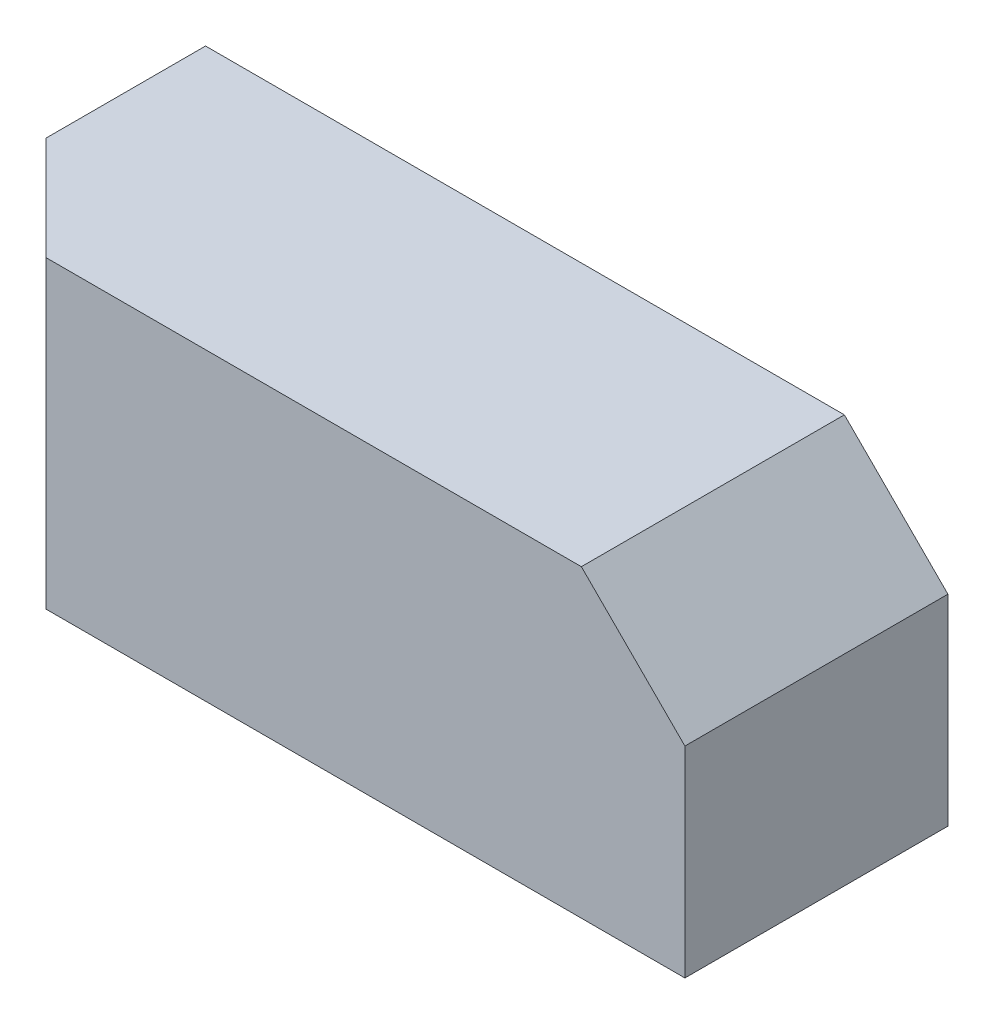
ISO-10303-21;
HEADER;
FILE_DESCRIPTION(('STEP AP214'),'2;1');
FILE_NAME('part.step','',(''),(''),'','','');
FILE_SCHEMA(('AUTOMOTIVE_DESIGN { 1 0 10303 214 1 1 1 1 }'));
ENDSEC;
DATA;
#1=APPLICATION_CONTEXT('core data for automotive mechanical design processes');
#2=APPLICATION_PROTOCOL_DEFINITION('international standard','automotive_design',2000,#1);
#3=PRODUCT_CONTEXT('',#1,'mechanical');
#4=PRODUCT('Part','Part','',(#3));
#5=PRODUCT_RELATED_PRODUCT_CATEGORY('part','',(#4));
#6=PRODUCT_DEFINITION_FORMATION('','',#4);
#7=PRODUCT_DEFINITION_CONTEXT('part definition',#1,'design');
#8=PRODUCT_DEFINITION('design','',#6,#7);
#9=PRODUCT_DEFINITION_SHAPE('','',#8);
#10=(LENGTH_UNIT() NAMED_UNIT(*) SI_UNIT(.MILLI.,.METRE.));
#11=(NAMED_UNIT(*) PLANE_ANGLE_UNIT() SI_UNIT($,.RADIAN.));
#12=(NAMED_UNIT(*) SI_UNIT($,.STERADIAN.) SOLID_ANGLE_UNIT());
#13=UNCERTAINTY_MEASURE_WITH_UNIT(LENGTH_MEASURE(1.E-05),#10,'distance_accuracy_value','');
#14=(GEOMETRIC_REPRESENTATION_CONTEXT(3) GLOBAL_UNCERTAINTY_ASSIGNED_CONTEXT((#13)) GLOBAL_UNIT_ASSIGNED_CONTEXT((#10,
#11,#12)) REPRESENTATION_CONTEXT('',''));
#15=CARTESIAN_POINT('',(0.,0.,0.));
#16=DIRECTION('',(0.,0.,1.));
#17=DIRECTION('',(1.,0.,0.));
#18=AXIS2_PLACEMENT_3D('',#15,#16,#17);
#19=CARTESIAN_POINT('',(18.0200892681084,10.758864967095,18.9255319926995));
#20=DIRECTION('',(1.,0.,0.));
#21=DIRECTION('',(0.,0.,-1.));
#22=AXIS2_PLACEMENT_3D('',#19,#20,#21);
#23=PLANE('',#22);
#24=DIRECTION('',(0.,-1.,0.));
#25=VECTOR('',#24,1.);
#26=CARTESIAN_POINT('',(18.0200892681084,10.758864967095,6.22553199269949));
#27=LINE('',#26,#25);
#28=CARTESIAN_POINT('',(18.0200892681084,30.459449893501,6.22553199269949));
#29=VERTEX_POINT('',#28);
#30=CARTESIAN_POINT('',(18.0200892681084,15.758864967095,6.22553199269949));
#31=VERTEX_POINT('',#30);
#32=EDGE_CURVE('E112',#29,#31,#27,.T.);
#33=ORIENTED_EDGE('',*,*,#32,.T.);
#34=DIRECTION('',(0.,0.,1.));
#35=VECTOR('',#34,1.);
#36=CARTESIAN_POINT('',(18.0200892681084,15.758864967095,18.9255319926995));
#37=LINE('',#36,#35);
#38=CARTESIAN_POINT('',(18.0200892681084,15.758864967095,13.9255319926995));
#39=VERTEX_POINT('',#38);
#40=EDGE_CURVE('E11',#31,#39,#37,.T.);
#41=ORIENTED_EDGE('',*,*,#40,.T.);
#42=DIRECTION('',(0.,1.,0.));
#43=VECTOR('',#42,1.);
#44=CARTESIAN_POINT('',(18.0200892681084,10.758864967095,13.9255319926995));
#45=LINE('',#44,#43);
#46=CARTESIAN_POINT('',(18.0200892681084,30.459449893501,13.9255319926995));
#47=VERTEX_POINT('',#46);
#48=EDGE_CURVE('E50',#39,#47,#45,.T.);
#49=ORIENTED_EDGE('',*,*,#48,.T.);
#50=DIRECTION('',(0.,0.,-1.));
#51=VECTOR('',#50,1.);
#52=CARTESIAN_POINT('',(18.0200892681084,30.459449893501,18.9255319926995));
#53=LINE('',#52,#51);
#54=EDGE_CURVE('E109',#47,#29,#53,.T.);
#55=ORIENTED_EDGE('',*,*,#54,.T.);
#56=EDGE_LOOP('',(#33,#41,#49,#55));
#57=FACE_BOUND('',#56,.T.);
#58=ADVANCED_FACE('F40',(#57),#23,.F.);
#59=CARTESIAN_POINT('',(18.0200892681084,10.758864967095,18.9255319926995));
#60=DIRECTION('',(0.,1.,0.));
#61=DIRECTION('',(0.,0.,1.));
#62=AXIS2_PLACEMENT_3D('',#59,#60,#61);
#63=PLANE('',#62);
#64=DIRECTION('',(-1.,0.,0.));
#65=VECTOR('',#64,1.);
#66=CARTESIAN_POINT('',(18.0200892681084,10.758864967095,13.9255319926995));
#67=LINE('',#66,#65);
#68=CARTESIAN_POINT('',(48.8676725993852,10.758864967095,13.9255319926995));
#69=VERTEX_POINT('',#68);
#70=CARTESIAN_POINT('',(23.0200892681084,10.758864967095,13.9255319926995));
#71=VERTEX_POINT('',#70);
#72=EDGE_CURVE('E171',#69,#71,#67,.T.);
#73=ORIENTED_EDGE('',*,*,#72,.T.);
#74=DIRECTION('',(0.,0.,-1.));
#75=VECTOR('',#74,1.);
#76=CARTESIAN_POINT('',(23.0200892681084,10.758864967095,18.9255319926995));
#77=LINE('',#76,#75);
#78=CARTESIAN_POINT('',(23.0200892681084,10.758864967095,11.2255319926995));
#79=VERTEX_POINT('',#78);
#80=EDGE_CURVE('E180',#71,#79,#77,.T.);
#81=ORIENTED_EDGE('',*,*,#80,.T.);
#82=DIRECTION('',(1.,0.,0.));
#83=VECTOR('',#82,1.);
#84=CARTESIAN_POINT('',(53.8676725993853,10.758864967095,11.2255319926995));
#85=LINE('',#84,#83);
#86=CARTESIAN_POINT('',(48.8676725993852,10.758864967095,11.2255319926995));
#87=VERTEX_POINT('',#86);
#88=EDGE_CURVE('E177',#79,#87,#85,.T.);
#89=ORIENTED_EDGE('',*,*,#88,.T.);
#90=DIRECTION('',(0.,0.,1.));
#91=VECTOR('',#90,1.);
#92=CARTESIAN_POINT('',(48.8676725993852,10.758864967095,18.9255319926995));
#93=LINE('',#92,#91);
#94=EDGE_CURVE('E174',#87,#69,#93,.T.);
#95=ORIENTED_EDGE('',*,*,#94,.T.);
#96=EDGE_LOOP('',(#73,#81,#89,#95));
#97=FACE_BOUND('',#96,.T.);
#98=ADVANCED_FACE('F210',(#97),#63,.F.);
#99=CARTESIAN_POINT('',(53.8676725993853,10.758864967095,18.9255319926995));
#100=DIRECTION('',(-1.,0.,0.));
#101=DIRECTION('',(0.,0.,1.));
#102=AXIS2_PLACEMENT_3D('',#99,#100,#101);
#103=PLANE('',#102);
#104=DIRECTION('',(0.,1.,0.));
#105=VECTOR('',#104,1.);
#106=CARTESIAN_POINT('',(53.8676725993853,10.758864967095,6.22553199269949));
#107=LINE('',#106,#105);
#108=CARTESIAN_POINT('',(53.8676725993853,15.758864967095,6.22553199269949));
#109=VERTEX_POINT('',#108);
#110=CARTESIAN_POINT('',(53.8676725993853,25.459449893501,6.22553199269949));
#111=VERTEX_POINT('',#110);
#112=EDGE_CURVE('E130',#109,#111,#107,.T.);
#113=ORIENTED_EDGE('',*,*,#112,.T.);
#114=DIRECTION('',(0.,0.,1.));
#115=VECTOR('',#114,1.);
#116=CARTESIAN_POINT('',(53.8676725993853,25.459449893501,18.9255319926995));
#117=LINE('',#116,#115);
#118=CARTESIAN_POINT('',(53.8676725993853,25.459449893501,18.9255319926995));
#119=VERTEX_POINT('',#118);
#120=EDGE_CURVE('E159',#111,#119,#117,.T.);
#121=ORIENTED_EDGE('',*,*,#120,.T.);
#122=DIRECTION('',(0.,1.,0.));
#123=VECTOR('',#122,1.);
#124=CARTESIAN_POINT('',(53.8676725993853,10.758864967095,18.9255319926995));
#125=LINE('',#124,#123);
#126=CARTESIAN_POINT('',(53.8676725993853,15.758864967095,18.9255319926995));
#127=VERTEX_POINT('',#126);
#128=EDGE_CURVE('E129',#127,#119,#125,.T.);
#129=ORIENTED_EDGE('',*,*,#128,.F.);
#130=DIRECTION('',(0.,0.,-1.));
#131=VECTOR('',#130,1.);
#132=CARTESIAN_POINT('',(53.8676725993853,15.758864967095,18.9255319926995));
#133=LINE('',#132,#131);
#134=EDGE_CURVE('E156',#127,#109,#133,.T.);
#135=ORIENTED_EDGE('',*,*,#134,.T.);
#136=EDGE_LOOP('',(#113,#121,#129,#135));
#137=FACE_BOUND('',#136,.T.);
#138=ADVANCED_FACE('F224',(#137),#103,.F.);
#139=CARTESIAN_POINT('',(18.0200892681084,30.459449893501,18.9255319926995));
#140=DIRECTION('',(0.,-1.,0.));
#141=DIRECTION('',(0.,0.,-1.));
#142=AXIS2_PLACEMENT_3D('',#139,#140,#141);
#143=PLANE('',#142);
#144=DIRECTION('',(-1.,0.,0.));
#145=VECTOR('',#144,1.);
#146=CARTESIAN_POINT('',(18.0200892681084,30.459449893501,18.9255319926995));
#147=LINE('',#146,#145);
#148=CARTESIAN_POINT('',(48.8676725993853,30.459449893501,18.9255319926995));
#149=VERTEX_POINT('',#148);
#150=CARTESIAN_POINT('',(23.0200892681084,30.459449893501,18.9255319926995));
#151=VERTEX_POINT('',#150);
#152=EDGE_CURVE('E118',#149,#151,#147,.T.);
#153=ORIENTED_EDGE('',*,*,#152,.F.);
#154=DIRECTION('',(0.,0.,-1.));
#155=VECTOR('',#154,1.);
#156=CARTESIAN_POINT('',(48.8676725993853,30.459449893501,18.9255319926995));
#157=LINE('',#156,#155);
#158=CARTESIAN_POINT('',(48.8676725993853,30.459449893501,6.22553199269949));
#159=VERTEX_POINT('',#158);
#160=EDGE_CURVE('E126',#149,#159,#157,.T.);
#161=ORIENTED_EDGE('',*,*,#160,.T.);
#162=DIRECTION('',(-1.,0.,0.));
#163=VECTOR('',#162,1.);
#164=CARTESIAN_POINT('',(18.0200892681084,30.459449893501,6.22553199269949));
#165=LINE('',#164,#163);
#166=EDGE_CURVE('E122',#159,#29,#165,.T.);
#167=ORIENTED_EDGE('',*,*,#166,.T.);
#168=ORIENTED_EDGE('',*,*,#54,.F.);
#169=DIRECTION('',(-0.707106781186547,0.,-0.707106781186548));
#170=VECTOR('',#169,1.);
#171=CARTESIAN_POINT('',(23.0200892681084,30.459449893501,18.9255319926995));
#172=LINE('',#171,#170);
#173=EDGE_CURVE('E117',#47,#151,#172,.F.);
#174=ORIENTED_EDGE('',*,*,#173,.T.);
#175=EDGE_LOOP('',(#153,#161,#167,#168,#174));
#176=FACE_BOUND('',#175,.T.);
#177=ADVANCED_FACE('F124',(#176),#143,.F.);
#178=CARTESIAN_POINT('',(18.0200892681084,10.758864967095,18.9255319926995));
#179=DIRECTION('',(0.,0.,-1.));
#180=DIRECTION('',(-1.,0.,0.));
#181=AXIS2_PLACEMENT_3D('',#178,#179,#180);
#182=PLANE('',#181);
#183=ORIENTED_EDGE('',*,*,#128,.T.);
#184=DIRECTION('',(0.707106781186546,-0.70710678118655,0.));
#185=VECTOR('',#184,1.);
#186=CARTESIAN_POINT('',(48.8676725993853,30.459449893501,18.9255319926995));
#187=LINE('',#186,#185);
#188=EDGE_CURVE('E168',#119,#149,#187,.F.);
#189=ORIENTED_EDGE('',*,*,#188,.T.);
#190=ORIENTED_EDGE('',*,*,#152,.T.);
#191=DIRECTION('',(0.,-1.,0.));
#192=VECTOR('',#191,1.);
#193=CARTESIAN_POINT('',(23.0200892681084,10.758864967095,18.9255319926995));
#194=LINE('',#193,#192);
#195=CARTESIAN_POINT('',(23.0200892681084,15.758864967095,18.9255319926995));
#196=VERTEX_POINT('',#195);
#197=EDGE_CURVE('E162',#151,#196,#194,.T.);
#198=ORIENTED_EDGE('',*,*,#197,.T.);
#199=DIRECTION('',(1.,0.,0.));
#200=VECTOR('',#199,1.);
#201=CARTESIAN_POINT('',(18.0200892681084,15.758864967095,18.9255319926995));
#202=LINE('',#201,#200);
#203=EDGE_CURVE('E165',#196,#127,#202,.T.);
#204=ORIENTED_EDGE('',*,*,#203,.T.);
#205=EDGE_LOOP('',(#183,#189,#190,#198,#204));
#206=FACE_BOUND('',#205,.T.);
#207=ADVANCED_FACE('F220',(#206),#182,.F.);
#208=CARTESIAN_POINT('',(18.0200892681084,10.758864967095,6.22553199269949));
#209=DIRECTION('',(0.,0.,-1.));
#210=DIRECTION('',(-1.,0.,0.));
#211=AXIS2_PLACEMENT_3D('',#208,#209,#210);
#212=PLANE('',#211);
#213=ORIENTED_EDGE('',*,*,#166,.F.);
#214=DIRECTION('',(-0.707106781186546,0.70710678118655,0.));
#215=VECTOR('',#214,1.);
#216=CARTESIAN_POINT('',(43.29417339695,36.0329490959364,6.22553199269949));
#217=LINE('',#216,#215);
#218=EDGE_CURVE('E153',#159,#111,#217,.F.);
#219=ORIENTED_EDGE('',*,*,#218,.T.);
#220=ORIENTED_EDGE('',*,*,#112,.F.);
#221=DIRECTION('',(-1.,0.,0.));
#222=VECTOR('',#221,1.);
#223=CARTESIAN_POINT('',(18.0200892681084,15.758864967095,6.22553199269949));
#224=LINE('',#223,#222);
#225=EDGE_CURVE('E135',#109,#31,#224,.T.);
#226=ORIENTED_EDGE('',*,*,#225,.T.);
#227=ORIENTED_EDGE('',*,*,#32,.F.);
#228=EDGE_LOOP('',(#213,#219,#220,#226,#227));
#229=FACE_BOUND('',#228,.T.);
#230=ADVANCED_FACE('F132',(#229),#212,.T.);
#231=CARTESIAN_POINT('',(48.8676725993853,30.459449893501,18.9255319926995));
#232=DIRECTION('',(-0.707106781186549,-0.707106781186545,0.));
#233=DIRECTION('',(0.,0.,-1.));
#234=AXIS2_PLACEMENT_3D('',#231,#232,#233);
#235=PLANE('',#234);
#236=ORIENTED_EDGE('',*,*,#188,.F.);
#237=ORIENTED_EDGE('',*,*,#120,.F.);
#238=ORIENTED_EDGE('',*,*,#218,.F.);
#239=ORIENTED_EDGE('',*,*,#160,.F.);
#240=EDGE_LOOP('',(#236,#237,#238,#239));
#241=FACE_BOUND('',#240,.T.);
#242=ADVANCED_FACE('F229',(#241),#235,.F.);
#243=CARTESIAN_POINT('',(23.0200892681084,10.758864967095,18.9255319926995));
#244=DIRECTION('',(0.707106781186548,0.,-0.707106781186547));
#245=DIRECTION('',(0.,-1.,0.));
#246=AXIS2_PLACEMENT_3D('',#243,#244,#245);
#247=PLANE('',#246);
#248=ORIENTED_EDGE('',*,*,#173,.F.);
#249=ORIENTED_EDGE('',*,*,#48,.F.);
#250=DIRECTION('',(0.707106781186547,0.,0.707106781186548));
#251=VECTOR('',#250,1.);
#252=CARTESIAN_POINT('',(18.0200892681084,15.758864967095,13.9255319926995));
#253=LINE('',#252,#251);
#254=EDGE_CURVE('E143',#196,#39,#253,.F.);
#255=ORIENTED_EDGE('',*,*,#254,.F.);
#256=ORIENTED_EDGE('',*,*,#197,.F.);
#257=EDGE_LOOP('',(#248,#249,#255,#256));
#258=FACE_BOUND('',#257,.T.);
#259=ADVANCED_FACE('F42',(#258),#247,.F.);
#260=CARTESIAN_POINT('',(18.0200892681084,15.758864967095,18.9255319926995));
#261=DIRECTION('',(0.,0.707106781186548,-0.707106781186547));
#262=DIRECTION('',(1.,0.,0.));
#263=AXIS2_PLACEMENT_3D('',#260,#261,#262);
#264=PLANE('',#263);
#265=DIRECTION('',(0.,-0.707106781186547,-0.707106781186548));
#266=VECTOR('',#265,1.);
#267=CARTESIAN_POINT('',(23.0200892681084,13.258864967095,16.4255319926995));
#268=LINE('',#267,#266);
#269=EDGE_CURVE('E194',#71,#196,#268,.F.);
#270=ORIENTED_EDGE('',*,*,#269,.F.);
#271=ORIENTED_EDGE('',*,*,#72,.F.);
#272=DIRECTION('',(0.577350269189626,0.577350269189625,0.577350269189626));
#273=VECTOR('',#272,1.);
#274=CARTESIAN_POINT('',(41.9184781556263,3.80967052333601,6.97633754894051));
#275=LINE('',#274,#273);
#276=EDGE_CURVE('E44',#127,#69,#275,.F.);
#277=ORIENTED_EDGE('',*,*,#276,.F.);
#278=ORIENTED_EDGE('',*,*,#203,.F.);
#279=EDGE_LOOP('',(#270,#271,#277,#278));
#280=FACE_BOUND('',#279,.T.);
#281=ADVANCED_FACE('F215',(#280),#264,.F.);
#282=CARTESIAN_POINT('',(53.8676725993853,15.758864967095,18.9255319926995));
#283=DIRECTION('',(-0.707106781186547,0.707106781186548,0.));
#284=DIRECTION('',(0.,0.,-1.));
#285=AXIS2_PLACEMENT_3D('',#282,#283,#284);
#286=PLANE('',#285);
#287=ORIENTED_EDGE('',*,*,#276,.T.);
#288=ORIENTED_EDGE('',*,*,#94,.F.);
#289=DIRECTION('',(-0.577350269189627,-0.577350269189626,0.577350269189625));
#290=VECTOR('',#289,1.);
#291=CARTESIAN_POINT('',(49.6343392660519,11.5255316337616,10.4588653260328));
#292=LINE('',#291,#290);
#293=EDGE_CURVE('E190',#109,#87,#292,.T.);
#294=ORIENTED_EDGE('',*,*,#293,.F.);
#295=ORIENTED_EDGE('',*,*,#134,.F.);
#296=EDGE_LOOP('',(#287,#288,#294,#295));
#297=FACE_BOUND('',#296,.T.);
#298=ADVANCED_FACE('F231',(#297),#286,.F.);
#299=CARTESIAN_POINT('',(18.0200892681084,15.758864967095,13.9255319926995));
#300=DIRECTION('',(-0.577350269189627,-0.577350269189626,0.577350269189625));
#301=DIRECTION('',(0.707106781186547,-0.707106781186548,0.));
#302=AXIS2_PLACEMENT_3D('',#299,#300,#301);
#303=PLANE('',#302);
#304=ORIENTED_EDGE('',*,*,#269,.T.);
#305=ORIENTED_EDGE('',*,*,#254,.T.);
#306=DIRECTION('',(-0.707106781186547,0.707106781186548,0.));
#307=VECTOR('',#306,1.);
#308=CARTESIAN_POINT('',(18.0200892681084,15.758864967095,13.9255319926995));
#309=LINE('',#308,#307);
#310=EDGE_CURVE('E58',#71,#39,#309,.T.);
#311=ORIENTED_EDGE('',*,*,#310,.F.);
#312=EDGE_LOOP('',(#304,#305,#311));
#313=FACE_BOUND('',#312,.T.);
#314=ADVANCED_FACE('F200',(#313),#303,.T.);
#315=CARTESIAN_POINT('',(18.0200892681084,10.758864967095,11.2255319926995));
#316=DIRECTION('',(0.,-0.707106781186547,-0.707106781186548));
#317=DIRECTION('',(-1.,0.,0.));
#318=AXIS2_PLACEMENT_3D('',#315,#316,#317);
#319=PLANE('',#318);
#320=ORIENTED_EDGE('',*,*,#293,.T.);
#321=ORIENTED_EDGE('',*,*,#88,.F.);
#322=DIRECTION('',(0.577350269189625,-0.577350269189627,0.577350269189625));
#323=VECTOR('',#322,1.);
#324=CARTESIAN_POINT('',(21.3534226014417,12.4255316337616,9.55886532603283));
#325=LINE('',#324,#323);
#326=EDGE_CURVE('E63',#31,#79,#325,.T.);
#327=ORIENTED_EDGE('',*,*,#326,.F.);
#328=ORIENTED_EDGE('',*,*,#225,.F.);
#329=EDGE_LOOP('',(#320,#321,#327,#328));
#330=FACE_BOUND('',#329,.T.);
#331=ADVANCED_FACE('F206',(#330),#319,.T.);
#332=CARTESIAN_POINT('',(23.0200892681084,10.758864967095,18.9255319926995));
#333=DIRECTION('',(0.707106781186548,0.707106781186547,0.));
#334=DIRECTION('',(0.,0.,-1.));
#335=AXIS2_PLACEMENT_3D('',#332,#333,#334);
#336=PLANE('',#335);
#337=ORIENTED_EDGE('',*,*,#310,.T.);
#338=ORIENTED_EDGE('',*,*,#40,.F.);
#339=ORIENTED_EDGE('',*,*,#326,.T.);
#340=ORIENTED_EDGE('',*,*,#80,.F.);
#341=EDGE_LOOP('',(#337,#338,#339,#340));
#342=FACE_BOUND('',#341,.T.);
#343=ADVANCED_FACE('F204',(#342),#336,.F.);
#344=CLOSED_SHELL('',(#58,#98,#138,#177,#207,#230,#242,#259,#281,#298,#314,#331,#343));
#345=MANIFOLD_SOLID_BREP('B2',#344);
#346=ADVANCED_BREP_SHAPE_REPRESENTATION('',(#18,#345),#14);
#347=SHAPE_DEFINITION_REPRESENTATION(#9,#346);
ENDSEC;
END-ISO-10303-21;
